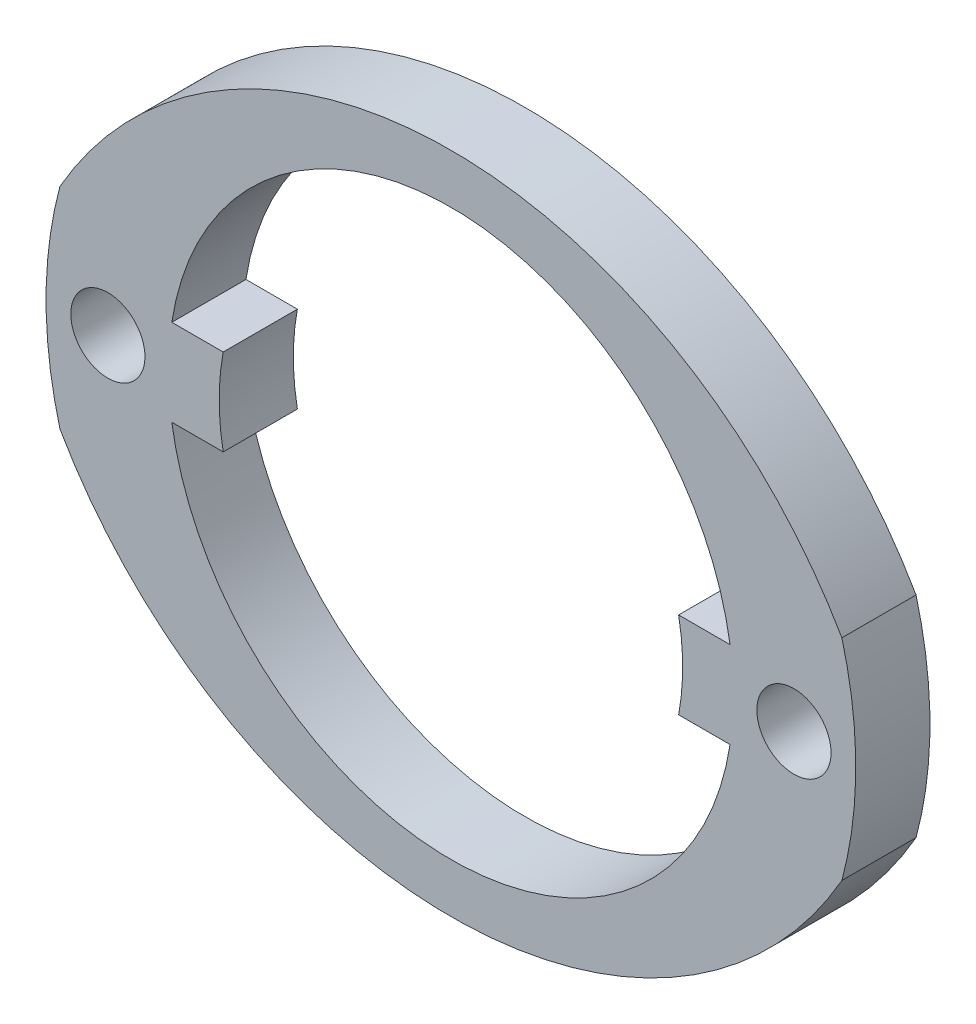
ISO-10303-21;
HEADER;
FILE_DESCRIPTION(('STEP AP214'),'2;1');
FILE_NAME('part.step','',(''),(''),'','','');
FILE_SCHEMA(('AUTOMOTIVE_DESIGN { 1 0 10303 214 1 1 1 1 }'));
ENDSEC;
DATA;
#1=APPLICATION_CONTEXT('core data for automotive mechanical design processes');
#2=APPLICATION_PROTOCOL_DEFINITION('international standard','automotive_design',2000,#1);
#3=PRODUCT_CONTEXT('',#1,'mechanical');
#4=PRODUCT('Part','Part','',(#3));
#5=PRODUCT_RELATED_PRODUCT_CATEGORY('part','',(#4));
#6=PRODUCT_DEFINITION_FORMATION('','',#4);
#7=PRODUCT_DEFINITION_CONTEXT('part definition',#1,'design');
#8=PRODUCT_DEFINITION('design','',#6,#7);
#9=PRODUCT_DEFINITION_SHAPE('','',#8);
#10=(LENGTH_UNIT() NAMED_UNIT(*) SI_UNIT(.MILLI.,.METRE.));
#11=(NAMED_UNIT(*) PLANE_ANGLE_UNIT() SI_UNIT($,.RADIAN.));
#12=(NAMED_UNIT(*) SI_UNIT($,.STERADIAN.) SOLID_ANGLE_UNIT());
#13=UNCERTAINTY_MEASURE_WITH_UNIT(LENGTH_MEASURE(1.E-05),#10,'distance_accuracy_value','');
#14=(GEOMETRIC_REPRESENTATION_CONTEXT(3) GLOBAL_UNCERTAINTY_ASSIGNED_CONTEXT((#13)) GLOBAL_UNIT_ASSIGNED_CONTEXT((#10,
#11,#12)) REPRESENTATION_CONTEXT('',''));
#15=CARTESIAN_POINT('',(0.,0.,0.));
#16=DIRECTION('',(0.,0.,1.));
#17=DIRECTION('',(1.,0.,0.));
#18=AXIS2_PLACEMENT_3D('',#15,#16,#17);
#19=CARTESIAN_POINT('',(-16.7203302622612,-2.16946923559103,3.));
#20=DIRECTION('',(0.,0.,1.));
#21=DIRECTION('',(1.,0.,0.));
#22=AXIS2_PLACEMENT_3D('',#19,#20,#21);
#23=PLANE('',#22);
#24=CARTESIAN_POINT('',(-2.84533026226121,0.225930840215327,3.));
#25=DIRECTION('',(0.,0.,1.));
#26=DIRECTION('',(1.,0.,0.));
#27=AXIS2_PLACEMENT_3D('',#24,#25,#26);
#28=CIRCLE('',#27,1.5);
#29=CARTESIAN_POINT('',(-1.3453302622612,0.225930840215327,3.));
#30=VERTEX_POINT('',#29);
#31=EDGE_CURVE('E159',#30,#30,#28,.T.);
#32=ORIENTED_EDGE('',*,*,#31,.F.);
#33=EDGE_LOOP('',(#32));
#34=FACE_BOUND('',#33,.T.);
#35=CARTESIAN_POINT('',(-16.7203302622612,-4.56486931139738,3.));
#36=DIRECTION('',(0.,0.,1.));
#37=DIRECTION('',(1.,0.,0.));
#38=AXIS2_PLACEMENT_3D('',#35,#36,#37);
#39=CIRCLE('',#38,18.2158001516126);
#40=CARTESIAN_POINT('',(-0.906504801016186,4.47605428327877,3.));
#41=VERTEX_POINT('',#40);
#42=CARTESIAN_POINT('',(-32.5341557235062,4.47605428327877,3.));
#43=VERTEX_POINT('',#42);
#44=EDGE_CURVE('E189',#41,#43,#39,.T.);
#45=ORIENTED_EDGE('',*,*,#44,.T.);
#46=CARTESIAN_POINT('',(-16.7203302622612,0.225930840215327,3.));
#47=DIRECTION('',(0.,0.,1.));
#48=DIRECTION('',(1.,0.,0.));
#49=AXIS2_PLACEMENT_3D('',#46,#47,#48);
#50=CIRCLE('',#49,16.375);
#51=CARTESIAN_POINT('',(-32.5341557235064,-4.0241926028475,3.));
#52=VERTEX_POINT('',#51);
#53=EDGE_CURVE('E192',#43,#52,#50,.T.);
#54=ORIENTED_EDGE('',*,*,#53,.T.);
#55=CARTESIAN_POINT('',(-16.7203302622612,5.01673099182792,3.));
#56=DIRECTION('',(0.,0.,1.));
#57=DIRECTION('',(1.,0.,0.));
#58=AXIS2_PLACEMENT_3D('',#55,#56,#57);
#59=CIRCLE('',#58,18.2158001516126);
#60=CARTESIAN_POINT('',(-0.90650480101595,-4.02419260284758,3.));
#61=VERTEX_POINT('',#60);
#62=EDGE_CURVE('E195',#52,#61,#59,.T.);
#63=ORIENTED_EDGE('',*,*,#62,.T.);
#64=CARTESIAN_POINT('',(-16.7203302622612,0.225930840215327,3.));
#65=DIRECTION('',(0.,0.,1.));
#66=DIRECTION('',(1.,0.,0.));
#67=AXIS2_PLACEMENT_3D('',#64,#65,#66);
#68=CIRCLE('',#67,16.375);
#69=EDGE_CURVE('E197',#61,#41,#68,.T.);
#70=ORIENTED_EDGE('',*,*,#69,.T.);
#71=EDGE_LOOP('',(#45,#54,#63,#70));
#72=FACE_BOUND('',#71,.T.);
#73=DIRECTION('',(-1.,0.,0.));
#74=VECTOR('',#73,1.);
#75=CARTESIAN_POINT('',(-7.51011175236688,-1.52406915978465,3.));
#76=LINE('',#75,#74);
#77=CARTESIAN_POINT('',(-5.43015200857539,-1.52406915978465,3.));
#78=VERTEX_POINT('',#77);
#79=CARTESIAN_POINT('',(-7.51011175236688,-1.52406915978465,3.));
#80=VERTEX_POINT('',#79);
#81=EDGE_CURVE('E129',#78,#80,#76,.T.);
#82=ORIENTED_EDGE('',*,*,#81,.F.);
#83=CARTESIAN_POINT('',(-16.7203302622612,0.225930840215327,3.));
#84=DIRECTION('',(0.,0.,1.));
#85=DIRECTION('',(1.,0.,0.));
#86=AXIS2_PLACEMENT_3D('',#83,#84,#85);
#87=CIRCLE('',#86,11.425);
#88=CARTESIAN_POINT('',(-28.010508515947,-1.52406915978465,3.));
#89=VERTEX_POINT('',#88);
#90=EDGE_CURVE('E121',#89,#78,#87,.T.);
#91=ORIENTED_EDGE('',*,*,#90,.F.);
#92=DIRECTION('',(-1.,0.,0.));
#93=VECTOR('',#92,1.);
#94=CARTESIAN_POINT('',(-28.010508515947,-1.52406915978465,3.));
#95=LINE('',#94,#93);
#96=CARTESIAN_POINT('',(-25.9305487721555,-1.52406915978465,3.));
#97=VERTEX_POINT('',#96);
#98=EDGE_CURVE('E156',#97,#89,#95,.T.);
#99=ORIENTED_EDGE('',*,*,#98,.F.);
#100=CARTESIAN_POINT('',(-16.7203302622612,0.225930840215327,3.));
#101=DIRECTION('',(0.,0.,1.));
#102=DIRECTION('',(1.,0.,0.));
#103=AXIS2_PLACEMENT_3D('',#100,#101,#102);
#104=CIRCLE('',#103,9.375);
#105=CARTESIAN_POINT('',(-25.9305487721555,1.97593084021536,3.));
#106=VERTEX_POINT('',#105);
#107=EDGE_CURVE('E154',#106,#97,#104,.T.);
#108=ORIENTED_EDGE('',*,*,#107,.F.);
#109=DIRECTION('',(1.,0.,0.));
#110=VECTOR('',#109,1.);
#111=CARTESIAN_POINT('',(-28.010508515947,1.97593084021536,3.));
#112=LINE('',#111,#110);
#113=CARTESIAN_POINT('',(-28.010508515947,1.97593084021536,3.));
#114=VERTEX_POINT('',#113);
#115=EDGE_CURVE('E152',#114,#106,#112,.T.);
#116=ORIENTED_EDGE('',*,*,#115,.F.);
#117=CARTESIAN_POINT('',(-16.7203302622612,0.225930840215327,3.));
#118=DIRECTION('',(0.,0.,1.));
#119=DIRECTION('',(1.,0.,0.));
#120=AXIS2_PLACEMENT_3D('',#117,#118,#119);
#121=CIRCLE('',#120,11.425);
#122=CARTESIAN_POINT('',(-5.43015200857538,1.97593084021525,3.));
#123=VERTEX_POINT('',#122);
#124=EDGE_CURVE('E150',#123,#114,#121,.T.);
#125=ORIENTED_EDGE('',*,*,#124,.F.);
#126=DIRECTION('',(1.,0.,0.));
#127=VECTOR('',#126,1.);
#128=CARTESIAN_POINT('',(-7.51011175236688,1.97593084021536,3.));
#129=LINE('',#128,#127);
#130=CARTESIAN_POINT('',(-7.51011175236688,1.97593084021536,3.));
#131=VERTEX_POINT('',#130);
#132=EDGE_CURVE('E145',#131,#123,#129,.T.);
#133=ORIENTED_EDGE('',*,*,#132,.F.);
#134=CARTESIAN_POINT('',(-16.7203302622612,0.225930840215327,3.));
#135=DIRECTION('',(0.,0.,1.));
#136=DIRECTION('',(1.,0.,0.));
#137=AXIS2_PLACEMENT_3D('',#134,#135,#136);
#138=CIRCLE('',#137,9.375);
#139=EDGE_CURVE('E143',#80,#131,#138,.T.);
#140=ORIENTED_EDGE('',*,*,#139,.F.);
#141=EDGE_LOOP('',(#82,#91,#99,#108,#116,#125,#133,#140));
#142=FACE_BOUND('',#141,.T.);
#143=CARTESIAN_POINT('',(-30.5953302622612,0.225930840215327,3.));
#144=DIRECTION('',(0.,0.,1.));
#145=DIRECTION('',(1.,0.,0.));
#146=AXIS2_PLACEMENT_3D('',#143,#144,#145);
#147=CIRCLE('',#146,1.5);
#148=CARTESIAN_POINT('',(-29.0953302622612,0.225930840215327,3.));
#149=VERTEX_POINT('',#148);
#150=EDGE_CURVE('E295',#149,#149,#147,.T.);
#151=ORIENTED_EDGE('',*,*,#150,.F.);
#152=EDGE_LOOP('',(#151));
#153=FACE_BOUND('',#152,.T.);
#154=ADVANCED_FACE('F32',(#34,#72,#142,#153),#23,.T.);
#155=CARTESIAN_POINT('',(-16.7203302622612,-2.16946923559103,0.));
#156=DIRECTION('',(0.,0.,1.));
#157=DIRECTION('',(1.,0.,0.));
#158=AXIS2_PLACEMENT_3D('',#155,#156,#157);
#159=PLANE('',#158);
#160=CARTESIAN_POINT('',(-16.7203302622612,-4.56486931139738,0.));
#161=DIRECTION('',(0.,0.,1.));
#162=DIRECTION('',(1.,0.,0.));
#163=AXIS2_PLACEMENT_3D('',#160,#161,#162);
#164=CIRCLE('',#163,18.2158001516126);
#165=CARTESIAN_POINT('',(-0.906504801016186,4.47605428327877,0.));
#166=VERTEX_POINT('',#165);
#167=CARTESIAN_POINT('',(-32.5341557235062,4.47605428327877,0.));
#168=VERTEX_POINT('',#167);
#169=EDGE_CURVE('E137',#166,#168,#164,.T.);
#170=ORIENTED_EDGE('',*,*,#169,.F.);
#171=CARTESIAN_POINT('',(-16.7203302622612,0.225930840215327,0.));
#172=DIRECTION('',(0.,0.,1.));
#173=DIRECTION('',(1.,0.,0.));
#174=AXIS2_PLACEMENT_3D('',#171,#172,#173);
#175=CIRCLE('',#174,16.375);
#176=CARTESIAN_POINT('',(-0.90650480101595,-4.02419260284758,0.));
#177=VERTEX_POINT('',#176);
#178=EDGE_CURVE('E193',#177,#166,#175,.T.);
#179=ORIENTED_EDGE('',*,*,#178,.F.);
#180=CARTESIAN_POINT('',(-16.7203302622612,5.01673099182792,0.));
#181=DIRECTION('',(0.,0.,1.));
#182=DIRECTION('',(1.,0.,0.));
#183=AXIS2_PLACEMENT_3D('',#180,#181,#182);
#184=CIRCLE('',#183,18.2158001516126);
#185=CARTESIAN_POINT('',(-32.5341557235064,-4.0241926028475,0.));
#186=VERTEX_POINT('',#185);
#187=EDGE_CURVE('E204',#186,#177,#184,.T.);
#188=ORIENTED_EDGE('',*,*,#187,.F.);
#189=CARTESIAN_POINT('',(-16.7203302622612,0.225930840215327,0.));
#190=DIRECTION('',(0.,0.,1.));
#191=DIRECTION('',(1.,0.,0.));
#192=AXIS2_PLACEMENT_3D('',#189,#190,#191);
#193=CIRCLE('',#192,16.375);
#194=EDGE_CURVE('E202',#168,#186,#193,.T.);
#195=ORIENTED_EDGE('',*,*,#194,.F.);
#196=EDGE_LOOP('',(#170,#179,#188,#195));
#197=FACE_BOUND('',#196,.T.);
#198=CARTESIAN_POINT('',(-16.7203302622612,0.225930840215327,0.));
#199=DIRECTION('',(0.,0.,1.));
#200=DIRECTION('',(1.,0.,0.));
#201=AXIS2_PLACEMENT_3D('',#198,#199,#200);
#202=CIRCLE('',#201,11.425);
#203=CARTESIAN_POINT('',(-28.010508515947,-1.52406915978465,0.));
#204=VERTEX_POINT('',#203);
#205=CARTESIAN_POINT('',(-5.43015200857539,-1.52406915978465,0.));
#206=VERTEX_POINT('',#205);
#207=EDGE_CURVE('E55',#204,#206,#202,.T.);
#208=ORIENTED_EDGE('',*,*,#207,.T.);
#209=DIRECTION('',(-1.,0.,0.));
#210=VECTOR('',#209,1.);
#211=CARTESIAN_POINT('',(-7.51011175236688,-1.52406915978465,0.));
#212=LINE('',#211,#210);
#213=CARTESIAN_POINT('',(-7.51011175236688,-1.52406915978465,0.));
#214=VERTEX_POINT('',#213);
#215=EDGE_CURVE('E136',#206,#214,#212,.T.);
#216=ORIENTED_EDGE('',*,*,#215,.T.);
#217=CARTESIAN_POINT('',(-16.7203302622612,0.225930840215327,0.));
#218=DIRECTION('',(0.,0.,1.));
#219=DIRECTION('',(1.,0.,0.));
#220=AXIS2_PLACEMENT_3D('',#217,#218,#219);
#221=CIRCLE('',#220,9.375);
#222=CARTESIAN_POINT('',(-7.51011175236688,1.97593084021536,0.));
#223=VERTEX_POINT('',#222);
#224=EDGE_CURVE('E161',#214,#223,#221,.T.);
#225=ORIENTED_EDGE('',*,*,#224,.T.);
#226=DIRECTION('',(1.,0.,0.));
#227=VECTOR('',#226,1.);
#228=CARTESIAN_POINT('',(-7.51011175236688,1.97593084021536,0.));
#229=LINE('',#228,#227);
#230=CARTESIAN_POINT('',(-5.43015200857538,1.97593084021525,0.));
#231=VERTEX_POINT('',#230);
#232=EDGE_CURVE('E164',#223,#231,#229,.T.);
#233=ORIENTED_EDGE('',*,*,#232,.T.);
#234=CARTESIAN_POINT('',(-16.7203302622612,0.225930840215327,0.));
#235=DIRECTION('',(0.,0.,1.));
#236=DIRECTION('',(1.,0.,0.));
#237=AXIS2_PLACEMENT_3D('',#234,#235,#236);
#238=CIRCLE('',#237,11.425);
#239=CARTESIAN_POINT('',(-28.010508515947,1.97593084021536,0.));
#240=VERTEX_POINT('',#239);
#241=EDGE_CURVE('E167',#231,#240,#238,.T.);
#242=ORIENTED_EDGE('',*,*,#241,.T.);
#243=DIRECTION('',(1.,0.,0.));
#244=VECTOR('',#243,1.);
#245=CARTESIAN_POINT('',(-28.010508515947,1.97593084021536,0.));
#246=LINE('',#245,#244);
#247=CARTESIAN_POINT('',(-25.9305487721555,1.97593084021536,0.));
#248=VERTEX_POINT('',#247);
#249=EDGE_CURVE('E170',#240,#248,#246,.T.);
#250=ORIENTED_EDGE('',*,*,#249,.T.);
#251=CARTESIAN_POINT('',(-16.7203302622612,0.225930840215327,0.));
#252=DIRECTION('',(0.,0.,1.));
#253=DIRECTION('',(1.,0.,0.));
#254=AXIS2_PLACEMENT_3D('',#251,#252,#253);
#255=CIRCLE('',#254,9.375);
#256=CARTESIAN_POINT('',(-25.9305487721555,-1.52406915978465,0.));
#257=VERTEX_POINT('',#256);
#258=EDGE_CURVE('E173',#248,#257,#255,.T.);
#259=ORIENTED_EDGE('',*,*,#258,.T.);
#260=DIRECTION('',(-1.,0.,0.));
#261=VECTOR('',#260,1.);
#262=CARTESIAN_POINT('',(-28.010508515947,-1.52406915978465,0.));
#263=LINE('',#262,#261);
#264=EDGE_CURVE('E130',#257,#204,#263,.T.);
#265=ORIENTED_EDGE('',*,*,#264,.T.);
#266=EDGE_LOOP('',(#208,#216,#225,#233,#242,#250,#259,#265));
#267=FACE_BOUND('',#266,.T.);
#268=CARTESIAN_POINT('',(-2.84533026226121,0.225930840215327,0.));
#269=DIRECTION('',(0.,0.,1.));
#270=DIRECTION('',(1.,0.,0.));
#271=AXIS2_PLACEMENT_3D('',#268,#269,#270);
#272=CIRCLE('',#271,1.5);
#273=CARTESIAN_POINT('',(-1.3453302622612,0.225930840215327,0.));
#274=VERTEX_POINT('',#273);
#275=EDGE_CURVE('E301',#274,#274,#272,.T.);
#276=ORIENTED_EDGE('',*,*,#275,.T.);
#277=EDGE_LOOP('',(#276));
#278=FACE_BOUND('',#277,.T.);
#279=CARTESIAN_POINT('',(-30.5953302622612,0.225930840215327,0.));
#280=DIRECTION('',(0.,0.,1.));
#281=DIRECTION('',(1.,0.,0.));
#282=AXIS2_PLACEMENT_3D('',#279,#280,#281);
#283=CIRCLE('',#282,1.5);
#284=CARTESIAN_POINT('',(-29.0953302622612,0.225930840215327,0.));
#285=VERTEX_POINT('',#284);
#286=EDGE_CURVE('E298',#285,#285,#283,.T.);
#287=ORIENTED_EDGE('',*,*,#286,.T.);
#288=EDGE_LOOP('',(#287));
#289=FACE_BOUND('',#288,.T.);
#290=ADVANCED_FACE('F222',(#197,#267,#278,#289),#159,.F.);
#291=CARTESIAN_POINT('',(-16.7203302622612,-4.56486931139738,3.));
#292=DIRECTION('',(0.,0.,-1.));
#293=DIRECTION('',(-1.,0.,0.));
#294=AXIS2_PLACEMENT_3D('',#291,#292,#293);
#295=CYLINDRICAL_SURFACE('',#294,18.2158001516126);
#296=ORIENTED_EDGE('',*,*,#169,.T.);
#297=DIRECTION('',(0.,0.,-1.));
#298=VECTOR('',#297,1.);
#299=CARTESIAN_POINT('',(-32.5341557235062,4.47605428327877,3.));
#300=LINE('',#299,#298);
#301=EDGE_CURVE('E11',#43,#168,#300,.T.);
#302=ORIENTED_EDGE('',*,*,#301,.F.);
#303=ORIENTED_EDGE('',*,*,#44,.F.);
#304=DIRECTION('',(0.,0.,-1.));
#305=VECTOR('',#304,1.);
#306=CARTESIAN_POINT('',(-0.906504801016186,4.47605428327877,3.));
#307=LINE('',#306,#305);
#308=EDGE_CURVE('E199',#41,#166,#307,.T.);
#309=ORIENTED_EDGE('',*,*,#308,.T.);
#310=EDGE_LOOP('',(#296,#302,#303,#309));
#311=FACE_BOUND('',#310,.T.);
#312=ADVANCED_FACE('F34',(#311),#295,.T.);
#313=CARTESIAN_POINT('',(-16.7203302622612,0.225930840215327,3.));
#314=DIRECTION('',(0.,0.,-1.));
#315=DIRECTION('',(-1.,0.,0.));
#316=AXIS2_PLACEMENT_3D('',#313,#314,#315);
#317=CYLINDRICAL_SURFACE('',#316,16.375);
#318=ORIENTED_EDGE('',*,*,#194,.T.);
#319=DIRECTION('',(0.,0.,-1.));
#320=VECTOR('',#319,1.);
#321=CARTESIAN_POINT('',(-32.5341557235064,-4.0241926028475,3.));
#322=LINE('',#321,#320);
#323=EDGE_CURVE('E40',#52,#186,#322,.T.);
#324=ORIENTED_EDGE('',*,*,#323,.F.);
#325=ORIENTED_EDGE('',*,*,#53,.F.);
#326=ORIENTED_EDGE('',*,*,#301,.T.);
#327=EDGE_LOOP('',(#318,#324,#325,#326));
#328=FACE_BOUND('',#327,.T.);
#329=ADVANCED_FACE('F232',(#328),#317,.T.);
#330=CARTESIAN_POINT('',(-16.7203302622612,5.01673099182792,3.));
#331=DIRECTION('',(0.,0.,-1.));
#332=DIRECTION('',(-1.,0.,0.));
#333=AXIS2_PLACEMENT_3D('',#330,#331,#332);
#334=CYLINDRICAL_SURFACE('',#333,18.2158001516126);
#335=ORIENTED_EDGE('',*,*,#187,.T.);
#336=DIRECTION('',(0.,0.,-1.));
#337=VECTOR('',#336,1.);
#338=CARTESIAN_POINT('',(-0.90650480101595,-4.02419260284758,3.));
#339=LINE('',#338,#337);
#340=EDGE_CURVE('E209',#61,#177,#339,.T.);
#341=ORIENTED_EDGE('',*,*,#340,.F.);
#342=ORIENTED_EDGE('',*,*,#62,.F.);
#343=ORIENTED_EDGE('',*,*,#323,.T.);
#344=EDGE_LOOP('',(#335,#341,#342,#343));
#345=FACE_BOUND('',#344,.T.);
#346=ADVANCED_FACE('F216',(#345),#334,.T.);
#347=CARTESIAN_POINT('',(-16.7203302622612,0.225930840215327,3.));
#348=DIRECTION('',(0.,0.,-1.));
#349=DIRECTION('',(-1.,0.,0.));
#350=AXIS2_PLACEMENT_3D('',#347,#348,#349);
#351=CYLINDRICAL_SURFACE('',#350,16.375);
#352=ORIENTED_EDGE('',*,*,#178,.T.);
#353=ORIENTED_EDGE('',*,*,#308,.F.);
#354=ORIENTED_EDGE('',*,*,#69,.F.);
#355=ORIENTED_EDGE('',*,*,#340,.T.);
#356=EDGE_LOOP('',(#352,#353,#354,#355));
#357=FACE_BOUND('',#356,.T.);
#358=ADVANCED_FACE('F226',(#357),#351,.T.);
#359=CARTESIAN_POINT('',(-16.7203302622612,0.225930840215327,3.));
#360=DIRECTION('',(0.,0.,-1.));
#361=DIRECTION('',(-1.,0.,0.));
#362=AXIS2_PLACEMENT_3D('',#359,#360,#361);
#363=CYLINDRICAL_SURFACE('',#362,11.425);
#364=ORIENTED_EDGE('',*,*,#207,.F.);
#365=DIRECTION('',(0.,0.,-1.));
#366=VECTOR('',#365,1.);
#367=CARTESIAN_POINT('',(-28.010508515947,-1.52406915978465,3.));
#368=LINE('',#367,#366);
#369=EDGE_CURVE('E125',#89,#204,#368,.T.);
#370=ORIENTED_EDGE('',*,*,#369,.F.);
#371=ORIENTED_EDGE('',*,*,#90,.T.);
#372=DIRECTION('',(0.,0.,-1.));
#373=VECTOR('',#372,1.);
#374=CARTESIAN_POINT('',(-5.43015200857539,-1.52406915978465,3.));
#375=LINE('',#374,#373);
#376=EDGE_CURVE('E124',#78,#206,#375,.T.);
#377=ORIENTED_EDGE('',*,*,#376,.T.);
#378=EDGE_LOOP('',(#364,#370,#371,#377));
#379=FACE_BOUND('',#378,.T.);
#380=ADVANCED_FACE('F123',(#379),#363,.F.);
#381=CARTESIAN_POINT('',(-7.51011175236688,-1.52406915978465,3.));
#382=DIRECTION('',(0.,-1.,0.));
#383=DIRECTION('',(0.,0.,-1.));
#384=AXIS2_PLACEMENT_3D('',#381,#382,#383);
#385=PLANE('',#384);
#386=ORIENTED_EDGE('',*,*,#215,.F.);
#387=ORIENTED_EDGE('',*,*,#376,.F.);
#388=ORIENTED_EDGE('',*,*,#81,.T.);
#389=DIRECTION('',(0.,0.,-1.));
#390=VECTOR('',#389,1.);
#391=CARTESIAN_POINT('',(-7.51011175236688,-1.52406915978465,3.));
#392=LINE('',#391,#390);
#393=EDGE_CURVE('E138',#80,#214,#392,.T.);
#394=ORIENTED_EDGE('',*,*,#393,.T.);
#395=EDGE_LOOP('',(#386,#387,#388,#394));
#396=FACE_BOUND('',#395,.T.);
#397=ADVANCED_FACE('F133',(#396),#385,.T.);
#398=CARTESIAN_POINT('',(-16.7203302622612,0.225930840215327,3.));
#399=DIRECTION('',(0.,0.,-1.));
#400=DIRECTION('',(-1.,0.,0.));
#401=AXIS2_PLACEMENT_3D('',#398,#399,#400);
#402=CYLINDRICAL_SURFACE('',#401,9.375);
#403=ORIENTED_EDGE('',*,*,#224,.F.);
#404=ORIENTED_EDGE('',*,*,#393,.F.);
#405=ORIENTED_EDGE('',*,*,#139,.T.);
#406=DIRECTION('',(0.,0.,-1.));
#407=VECTOR('',#406,1.);
#408=CARTESIAN_POINT('',(-7.51011175236688,1.97593084021536,3.));
#409=LINE('',#408,#407);
#410=EDGE_CURVE('E186',#131,#223,#409,.T.);
#411=ORIENTED_EDGE('',*,*,#410,.T.);
#412=EDGE_LOOP('',(#403,#404,#405,#411));
#413=FACE_BOUND('',#412,.T.);
#414=ADVANCED_FACE('F257',(#413),#402,.F.);
#415=CARTESIAN_POINT('',(-7.51011175236688,1.97593084021536,3.));
#416=DIRECTION('',(0.,1.,0.));
#417=DIRECTION('',(-1.,0.,0.));
#418=AXIS2_PLACEMENT_3D('',#415,#416,#417);
#419=PLANE('',#418);
#420=ORIENTED_EDGE('',*,*,#232,.F.);
#421=ORIENTED_EDGE('',*,*,#410,.F.);
#422=ORIENTED_EDGE('',*,*,#132,.T.);
#423=DIRECTION('',(0.,0.,-1.));
#424=VECTOR('',#423,1.);
#425=CARTESIAN_POINT('',(-5.43015200857538,1.97593084021525,3.));
#426=LINE('',#425,#424);
#427=EDGE_CURVE('E184',#123,#231,#426,.T.);
#428=ORIENTED_EDGE('',*,*,#427,.T.);
#429=EDGE_LOOP('',(#420,#421,#422,#428));
#430=FACE_BOUND('',#429,.T.);
#431=ADVANCED_FACE('F261',(#430),#419,.T.);
#432=CARTESIAN_POINT('',(-16.7203302622612,0.225930840215327,3.));
#433=DIRECTION('',(0.,0.,-1.));
#434=DIRECTION('',(-1.,0.,0.));
#435=AXIS2_PLACEMENT_3D('',#432,#433,#434);
#436=CYLINDRICAL_SURFACE('',#435,11.425);
#437=ORIENTED_EDGE('',*,*,#241,.F.);
#438=ORIENTED_EDGE('',*,*,#427,.F.);
#439=ORIENTED_EDGE('',*,*,#124,.T.);
#440=DIRECTION('',(0.,0.,-1.));
#441=VECTOR('',#440,1.);
#442=CARTESIAN_POINT('',(-28.010508515947,1.97593084021536,3.));
#443=LINE('',#442,#441);
#444=EDGE_CURVE('E182',#114,#240,#443,.T.);
#445=ORIENTED_EDGE('',*,*,#444,.T.);
#446=EDGE_LOOP('',(#437,#438,#439,#445));
#447=FACE_BOUND('',#446,.T.);
#448=ADVANCED_FACE('F267',(#447),#436,.F.);
#449=CARTESIAN_POINT('',(-28.010508515947,1.97593084021536,3.));
#450=DIRECTION('',(0.,1.,0.));
#451=DIRECTION('',(0.,0.,1.));
#452=AXIS2_PLACEMENT_3D('',#449,#450,#451);
#453=PLANE('',#452);
#454=ORIENTED_EDGE('',*,*,#249,.F.);
#455=ORIENTED_EDGE('',*,*,#444,.F.);
#456=ORIENTED_EDGE('',*,*,#115,.T.);
#457=DIRECTION('',(0.,0.,-1.));
#458=VECTOR('',#457,1.);
#459=CARTESIAN_POINT('',(-25.9305487721555,1.97593084021536,3.));
#460=LINE('',#459,#458);
#461=EDGE_CURVE('E180',#106,#248,#460,.T.);
#462=ORIENTED_EDGE('',*,*,#461,.T.);
#463=EDGE_LOOP('',(#454,#455,#456,#462));
#464=FACE_BOUND('',#463,.T.);
#465=ADVANCED_FACE('F271',(#464),#453,.T.);
#466=CARTESIAN_POINT('',(-16.7203302622612,0.225930840215327,3.));
#467=DIRECTION('',(0.,0.,-1.));
#468=DIRECTION('',(-1.,0.,0.));
#469=AXIS2_PLACEMENT_3D('',#466,#467,#468);
#470=CYLINDRICAL_SURFACE('',#469,9.375);
#471=ORIENTED_EDGE('',*,*,#258,.F.);
#472=ORIENTED_EDGE('',*,*,#461,.F.);
#473=ORIENTED_EDGE('',*,*,#107,.T.);
#474=DIRECTION('',(0.,0.,-1.));
#475=VECTOR('',#474,1.);
#476=CARTESIAN_POINT('',(-25.9305487721555,-1.52406915978465,3.));
#477=LINE('',#476,#475);
#478=EDGE_CURVE('E47',#97,#257,#477,.T.);
#479=ORIENTED_EDGE('',*,*,#478,.T.);
#480=EDGE_LOOP('',(#471,#472,#473,#479));
#481=FACE_BOUND('',#480,.T.);
#482=ADVANCED_FACE('F275',(#481),#470,.F.);
#483=CARTESIAN_POINT('',(-28.010508515947,-1.52406915978465,3.));
#484=DIRECTION('',(0.,-1.,0.));
#485=DIRECTION('',(0.,0.,-1.));
#486=AXIS2_PLACEMENT_3D('',#483,#484,#485);
#487=PLANE('',#486);
#488=ORIENTED_EDGE('',*,*,#264,.F.);
#489=ORIENTED_EDGE('',*,*,#478,.F.);
#490=ORIENTED_EDGE('',*,*,#98,.T.);
#491=ORIENTED_EDGE('',*,*,#369,.T.);
#492=EDGE_LOOP('',(#488,#489,#490,#491));
#493=FACE_BOUND('',#492,.T.);
#494=ADVANCED_FACE('F279',(#493),#487,.T.);
#495=CARTESIAN_POINT('',(-2.84533026226121,0.225930840215327,3.));
#496=DIRECTION('',(0.,0.,-1.));
#497=DIRECTION('',(-1.,0.,0.));
#498=AXIS2_PLACEMENT_3D('',#495,#496,#497);
#499=CYLINDRICAL_SURFACE('',#498,1.5);
#500=ORIENTED_EDGE('',*,*,#31,.T.);
#501=EDGE_LOOP('',(#500));
#502=FACE_BOUND('',#501,.T.);
#503=ORIENTED_EDGE('',*,*,#275,.F.);
#504=EDGE_LOOP('',(#503));
#505=FACE_BOUND('',#504,.T.);
#506=ADVANCED_FACE('F283',(#502,#505),#499,.F.);
#507=CARTESIAN_POINT('',(-30.5953302622612,0.225930840215327,3.));
#508=DIRECTION('',(0.,0.,-1.));
#509=DIRECTION('',(-1.,0.,0.));
#510=AXIS2_PLACEMENT_3D('',#507,#508,#509);
#511=CYLINDRICAL_SURFACE('',#510,1.5);
#512=ORIENTED_EDGE('',*,*,#150,.T.);
#513=EDGE_LOOP('',(#512));
#514=FACE_BOUND('',#513,.T.);
#515=ORIENTED_EDGE('',*,*,#286,.F.);
#516=EDGE_LOOP('',(#515));
#517=FACE_BOUND('',#516,.T.);
#518=ADVANCED_FACE('F286',(#514,#517),#511,.F.);
#519=CLOSED_SHELL('',(#154,#290,#312,#329,#346,#358,#380,#397,#414,#431,#448,#465,#482,#494,
#506,#518));
#520=MANIFOLD_SOLID_BREP('B2',#519);
#521=ADVANCED_BREP_SHAPE_REPRESENTATION('',(#18,#520),#14);
#522=SHAPE_DEFINITION_REPRESENTATION(#9,#521);
ENDSEC;
END-ISO-10303-21;
